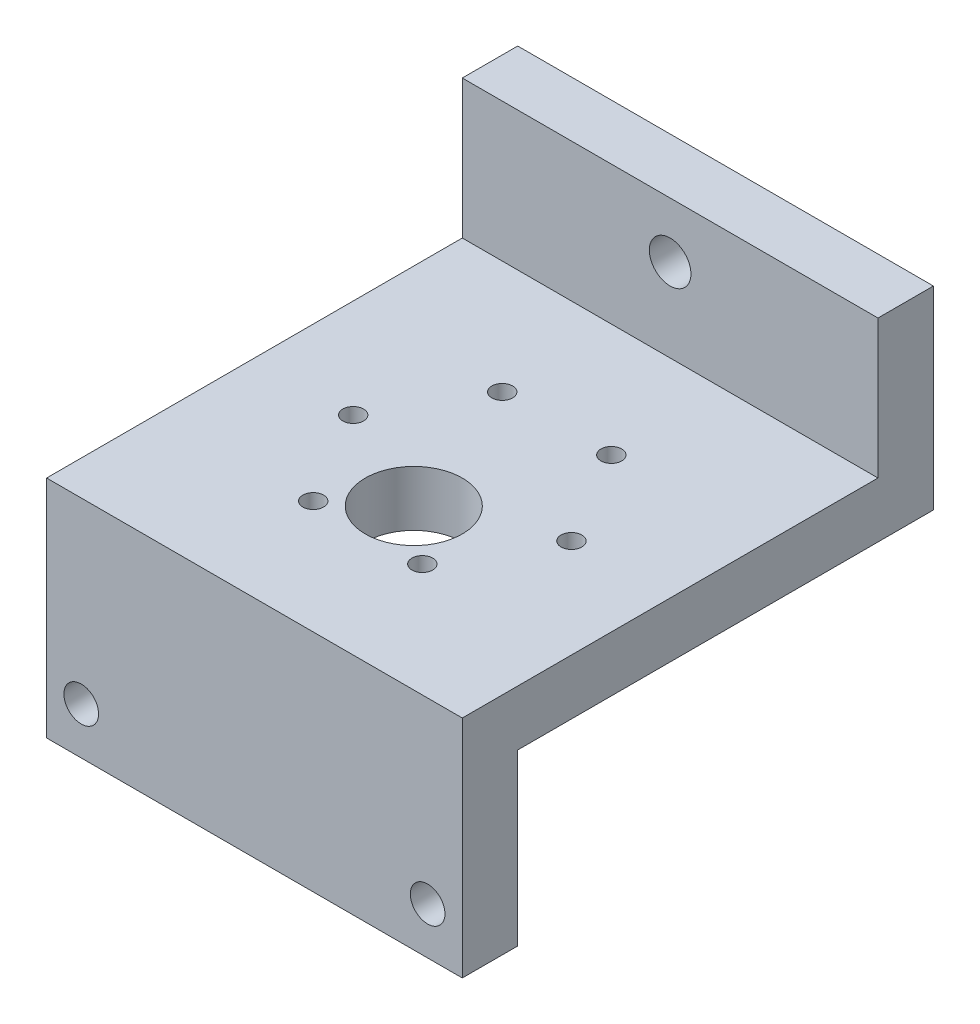
ISO-10303-21;
HEADER;
FILE_DESCRIPTION(('STEP AP214'),'2;1');
FILE_NAME('part.step','',(''),(''),'','','');
FILE_SCHEMA(('AUTOMOTIVE_DESIGN { 1 0 10303 214 1 1 1 1 }'));
ENDSEC;
DATA;
#1=APPLICATION_CONTEXT('core data for automotive mechanical design processes');
#2=APPLICATION_PROTOCOL_DEFINITION('international standard','automotive_design',2000,#1);
#3=PRODUCT_CONTEXT('',#1,'mechanical');
#4=PRODUCT('Part','Part','',(#3));
#5=PRODUCT_RELATED_PRODUCT_CATEGORY('part','',(#4));
#6=PRODUCT_DEFINITION_FORMATION('','',#4);
#7=PRODUCT_DEFINITION_CONTEXT('part definition',#1,'design');
#8=PRODUCT_DEFINITION('design','',#6,#7);
#9=PRODUCT_DEFINITION_SHAPE('','',#8);
#10=(LENGTH_UNIT() NAMED_UNIT(*) SI_UNIT(.MILLI.,.METRE.));
#11=(NAMED_UNIT(*) PLANE_ANGLE_UNIT() SI_UNIT($,.RADIAN.));
#12=(NAMED_UNIT(*) SI_UNIT($,.STERADIAN.) SOLID_ANGLE_UNIT());
#13=UNCERTAINTY_MEASURE_WITH_UNIT(LENGTH_MEASURE(1.E-05),#10,'distance_accuracy_value','');
#14=(GEOMETRIC_REPRESENTATION_CONTEXT(3) GLOBAL_UNCERTAINTY_ASSIGNED_CONTEXT((#13)) GLOBAL_UNIT_ASSIGNED_CONTEXT((#10,
#11,#12)) REPRESENTATION_CONTEXT('',''));
#15=CARTESIAN_POINT('',(0.,0.,0.));
#16=DIRECTION('',(0.,0.,1.));
#17=DIRECTION('',(1.,0.,0.));
#18=AXIS2_PLACEMENT_3D('',#15,#16,#17);
#19=CARTESIAN_POINT('',(30.,20.,-8.));
#20=DIRECTION('',(0.,-1.,0.));
#21=DIRECTION('',(0.,0.,-1.));
#22=AXIS2_PLACEMENT_3D('',#19,#20,#21);
#23=PLANE('',#22);
#24=DIRECTION('',(0.,0.,1.));
#25=VECTOR('',#24,1.);
#26=CARTESIAN_POINT('',(-30.,20.,-8.));
#27=LINE('',#26,#25);
#28=CARTESIAN_POINT('',(-30.,20.,-8.));
#29=VERTEX_POINT('',#28);
#30=CARTESIAN_POINT('',(-30.,20.,0.));
#31=VERTEX_POINT('',#30);
#32=EDGE_CURVE('E170',#29,#31,#27,.T.);
#33=ORIENTED_EDGE('',*,*,#32,.T.);
#34=DIRECTION('',(-1.,0.,0.));
#35=VECTOR('',#34,1.);
#36=CARTESIAN_POINT('',(30.,20.,0.));
#37=LINE('',#36,#35);
#38=CARTESIAN_POINT('',(30.,20.,0.));
#39=VERTEX_POINT('',#38);
#40=EDGE_CURVE('E44',#39,#31,#37,.T.);
#41=ORIENTED_EDGE('',*,*,#40,.F.);
#42=DIRECTION('',(0.,0.,1.));
#43=VECTOR('',#42,1.);
#44=CARTESIAN_POINT('',(30.,20.,-8.));
#45=LINE('',#44,#43);
#46=CARTESIAN_POINT('',(30.,20.,-8.));
#47=VERTEX_POINT('',#46);
#48=EDGE_CURVE('E215',#47,#39,#45,.T.);
#49=ORIENTED_EDGE('',*,*,#48,.F.);
#50=DIRECTION('',(-1.,0.,0.));
#51=VECTOR('',#50,1.);
#52=CARTESIAN_POINT('',(30.,20.,-8.));
#53=LINE('',#52,#51);
#54=EDGE_CURVE('E220',#47,#29,#53,.T.);
#55=ORIENTED_EDGE('',*,*,#54,.T.);
#56=EDGE_LOOP('',(#33,#41,#49,#55));
#57=FACE_BOUND('',#56,.T.);
#58=ADVANCED_FACE('F35',(#57),#23,.F.);
#59=CARTESIAN_POINT('',(30.,20.,0.));
#60=DIRECTION('',(0.,0.,-1.));
#61=DIRECTION('',(0.,1.,0.));
#62=AXIS2_PLACEMENT_3D('',#59,#60,#61);
#63=PLANE('',#62);
#64=CARTESIAN_POINT('',(0.,12.,0.));
#65=DIRECTION('',(0.,0.,1.));
#66=DIRECTION('',(1.,0.,0.));
#67=AXIS2_PLACEMENT_3D('',#64,#65,#66);
#68=CIRCLE('',#67,3.);
#69=CARTESIAN_POINT('',(3.,12.,0.));
#70=VERTEX_POINT('',#69);
#71=EDGE_CURVE('E131',#70,#70,#68,.T.);
#72=ORIENTED_EDGE('',*,*,#71,.F.);
#73=EDGE_LOOP('',(#72));
#74=FACE_BOUND('',#73,.T.);
#75=DIRECTION('',(0.,-1.,0.));
#76=VECTOR('',#75,1.);
#77=CARTESIAN_POINT('',(-30.,20.,0.));
#78=LINE('',#77,#76);
#79=CARTESIAN_POINT('',(-30.,0.,0.));
#80=VERTEX_POINT('',#79);
#81=EDGE_CURVE('E223',#31,#80,#78,.T.);
#82=ORIENTED_EDGE('',*,*,#81,.T.);
#83=DIRECTION('',(-1.,0.,0.));
#84=VECTOR('',#83,1.);
#85=CARTESIAN_POINT('',(30.,0.,0.));
#86=LINE('',#85,#84);
#87=CARTESIAN_POINT('',(30.,0.,0.));
#88=VERTEX_POINT('',#87);
#89=EDGE_CURVE('E156',#88,#80,#86,.T.);
#90=ORIENTED_EDGE('',*,*,#89,.F.);
#91=DIRECTION('',(0.,-1.,0.));
#92=VECTOR('',#91,1.);
#93=CARTESIAN_POINT('',(30.,20.,0.));
#94=LINE('',#93,#92);
#95=EDGE_CURVE('E92',#39,#88,#94,.T.);
#96=ORIENTED_EDGE('',*,*,#95,.F.);
#97=ORIENTED_EDGE('',*,*,#40,.T.);
#98=EDGE_LOOP('',(#82,#90,#96,#97));
#99=FACE_BOUND('',#98,.T.);
#100=ADVANCED_FACE('F234',(#74,#99),#63,.F.);
#101=CARTESIAN_POINT('',(30.,0.,0.));
#102=DIRECTION('',(0.,-1.,0.));
#103=DIRECTION('',(0.,0.,-1.));
#104=AXIS2_PLACEMENT_3D('',#101,#102,#103);
#105=PLANE('',#104);
#106=CARTESIAN_POINT('',(7.87499999999999,0.,16.3600998903951));
#107=DIRECTION('',(0.,1.,0.));
#108=DIRECTION('',(0.,0.,1.));
#109=AXIS2_PLACEMENT_3D('',#106,#107,#108);
#110=CIRCLE('',#109,1.5);
#111=CARTESIAN_POINT('',(7.87499999999999,0.,17.8600998903951));
#112=VERTEX_POINT('',#111);
#113=EDGE_CURVE('E193',#112,#112,#110,.T.);
#114=ORIENTED_EDGE('',*,*,#113,.F.);
#115=EDGE_LOOP('',(#114));
#116=FACE_BOUND('',#115,.T.);
#117=CARTESIAN_POINT('',(-7.87500000000001,0.,16.3600998903951));
#118=DIRECTION('',(0.,1.,0.));
#119=DIRECTION('',(0.,0.,1.));
#120=AXIS2_PLACEMENT_3D('',#117,#118,#119);
#121=CIRCLE('',#120,1.5);
#122=CARTESIAN_POINT('',(-7.87500000000001,0.,17.8600998903951));
#123=VERTEX_POINT('',#122);
#124=EDGE_CURVE('E190',#123,#123,#121,.T.);
#125=ORIENTED_EDGE('',*,*,#124,.F.);
#126=EDGE_LOOP('',(#125));
#127=FACE_BOUND('',#126,.T.);
#128=CARTESIAN_POINT('',(-15.75,0.,30.));
#129=DIRECTION('',(0.,1.,0.));
#130=DIRECTION('',(0.,0.,1.));
#131=AXIS2_PLACEMENT_3D('',#128,#129,#130);
#132=CIRCLE('',#131,1.5);
#133=CARTESIAN_POINT('',(-15.75,0.,31.5));
#134=VERTEX_POINT('',#133);
#135=EDGE_CURVE('E187',#134,#134,#132,.T.);
#136=ORIENTED_EDGE('',*,*,#135,.F.);
#137=EDGE_LOOP('',(#136));
#138=FACE_BOUND('',#137,.T.);
#139=CARTESIAN_POINT('',(-7.875,0.,43.6399001096049));
#140=DIRECTION('',(0.,1.,0.));
#141=DIRECTION('',(0.,0.,1.));
#142=AXIS2_PLACEMENT_3D('',#139,#140,#141);
#143=CIRCLE('',#142,1.5);
#144=CARTESIAN_POINT('',(-7.875,0.,45.1399001096049));
#145=VERTEX_POINT('',#144);
#146=EDGE_CURVE('E183',#145,#145,#143,.T.);
#147=ORIENTED_EDGE('',*,*,#146,.F.);
#148=EDGE_LOOP('',(#147));
#149=FACE_BOUND('',#148,.T.);
#150=CARTESIAN_POINT('',(7.875,0.,43.6399001096049));
#151=DIRECTION('',(0.,1.,0.));
#152=DIRECTION('',(0.,0.,1.));
#153=AXIS2_PLACEMENT_3D('',#150,#151,#152);
#154=CIRCLE('',#153,1.5);
#155=CARTESIAN_POINT('',(7.875,0.,45.1399001096049));
#156=VERTEX_POINT('',#155);
#157=EDGE_CURVE('E179',#156,#156,#154,.T.);
#158=ORIENTED_EDGE('',*,*,#157,.F.);
#159=EDGE_LOOP('',(#158));
#160=FACE_BOUND('',#159,.T.);
#161=CARTESIAN_POINT('',(15.75,0.,30.));
#162=DIRECTION('',(0.,1.,0.));
#163=DIRECTION('',(0.,0.,1.));
#164=AXIS2_PLACEMENT_3D('',#161,#162,#163);
#165=CIRCLE('',#164,1.5);
#166=CARTESIAN_POINT('',(15.75,0.,31.5));
#167=VERTEX_POINT('',#166);
#168=EDGE_CURVE('E175',#167,#167,#165,.T.);
#169=ORIENTED_EDGE('',*,*,#168,.F.);
#170=EDGE_LOOP('',(#169));
#171=FACE_BOUND('',#170,.T.);
#172=CARTESIAN_POINT('',(0.,0.,37.));
#173=DIRECTION('',(0.,1.,0.));
#174=DIRECTION('',(0.,0.,1.));
#175=AXIS2_PLACEMENT_3D('',#172,#173,#174);
#176=CIRCLE('',#175,7.);
#177=CARTESIAN_POINT('',(0.,0.,44.));
#178=VERTEX_POINT('',#177);
#179=EDGE_CURVE('E171',#178,#178,#176,.T.);
#180=ORIENTED_EDGE('',*,*,#179,.F.);
#181=EDGE_LOOP('',(#180));
#182=FACE_BOUND('',#181,.T.);
#183=DIRECTION('',(0.,0.,1.));
#184=VECTOR('',#183,1.);
#185=CARTESIAN_POINT('',(-30.,0.,0.));
#186=LINE('',#185,#184);
#187=CARTESIAN_POINT('',(-30.,0.,60.));
#188=VERTEX_POINT('',#187);
#189=EDGE_CURVE('E151',#80,#188,#186,.T.);
#190=ORIENTED_EDGE('',*,*,#189,.T.);
#191=DIRECTION('',(1.,0.,0.));
#192=VECTOR('',#191,1.);
#193=CARTESIAN_POINT('',(-30.,0.,60.));
#194=LINE('',#193,#192);
#195=CARTESIAN_POINT('',(30.,0.,60.));
#196=VERTEX_POINT('',#195);
#197=EDGE_CURVE('E129',#188,#196,#194,.T.);
#198=ORIENTED_EDGE('',*,*,#197,.T.);
#199=DIRECTION('',(0.,0.,1.));
#200=VECTOR('',#199,1.);
#201=CARTESIAN_POINT('',(30.,0.,0.));
#202=LINE('',#201,#200);
#203=EDGE_CURVE('E146',#88,#196,#202,.T.);
#204=ORIENTED_EDGE('',*,*,#203,.F.);
#205=ORIENTED_EDGE('',*,*,#89,.T.);
#206=EDGE_LOOP('',(#190,#198,#204,#205));
#207=FACE_BOUND('',#206,.T.);
#208=ADVANCED_FACE('F237',(#116,#127,#138,#149,#160,#171,#182,#207),#105,.F.);
#209=CARTESIAN_POINT('',(30.,-8.00000000000001,52.));
#210=DIRECTION('',(0.,1.,0.));
#211=DIRECTION('',(0.,0.,1.));
#212=AXIS2_PLACEMENT_3D('',#209,#210,#211);
#213=PLANE('',#212);
#214=CARTESIAN_POINT('',(7.87499999999999,-8.00000000000001,16.3600998903951));
#215=DIRECTION('',(0.,1.,0.));
#216=DIRECTION('',(0.,0.,1.));
#217=AXIS2_PLACEMENT_3D('',#214,#215,#216);
#218=CIRCLE('',#217,1.5);
#219=CARTESIAN_POINT('',(7.87499999999999,-8.00000000000001,17.8600998903951));
#220=VERTEX_POINT('',#219);
#221=EDGE_CURVE('E191',#220,#220,#218,.T.);
#222=ORIENTED_EDGE('',*,*,#221,.T.);
#223=EDGE_LOOP('',(#222));
#224=FACE_BOUND('',#223,.T.);
#225=CARTESIAN_POINT('',(-7.87500000000001,-8.00000000000001,16.3600998903951));
#226=DIRECTION('',(0.,1.,0.));
#227=DIRECTION('',(0.,0.,1.));
#228=AXIS2_PLACEMENT_3D('',#225,#226,#227);
#229=CIRCLE('',#228,1.5);
#230=CARTESIAN_POINT('',(-7.87500000000001,-8.00000000000001,17.8600998903951));
#231=VERTEX_POINT('',#230);
#232=EDGE_CURVE('E188',#231,#231,#229,.T.);
#233=ORIENTED_EDGE('',*,*,#232,.T.);
#234=EDGE_LOOP('',(#233));
#235=FACE_BOUND('',#234,.T.);
#236=CARTESIAN_POINT('',(-15.75,-8.00000000000001,30.));
#237=DIRECTION('',(0.,1.,0.));
#238=DIRECTION('',(0.,0.,1.));
#239=AXIS2_PLACEMENT_3D('',#236,#237,#238);
#240=CIRCLE('',#239,1.5);
#241=CARTESIAN_POINT('',(-15.75,-8.00000000000001,31.5));
#242=VERTEX_POINT('',#241);
#243=EDGE_CURVE('E184',#242,#242,#240,.T.);
#244=ORIENTED_EDGE('',*,*,#243,.T.);
#245=EDGE_LOOP('',(#244));
#246=FACE_BOUND('',#245,.T.);
#247=CARTESIAN_POINT('',(-7.875,-8.00000000000001,43.6399001096049));
#248=DIRECTION('',(0.,1.,0.));
#249=DIRECTION('',(0.,0.,1.));
#250=AXIS2_PLACEMENT_3D('',#247,#248,#249);
#251=CIRCLE('',#250,1.5);
#252=CARTESIAN_POINT('',(-7.875,-8.00000000000001,45.1399001096049));
#253=VERTEX_POINT('',#252);
#254=EDGE_CURVE('E180',#253,#253,#251,.T.);
#255=ORIENTED_EDGE('',*,*,#254,.T.);
#256=EDGE_LOOP('',(#255));
#257=FACE_BOUND('',#256,.T.);
#258=CARTESIAN_POINT('',(7.875,-8.00000000000001,43.6399001096049));
#259=DIRECTION('',(0.,1.,0.));
#260=DIRECTION('',(0.,0.,1.));
#261=AXIS2_PLACEMENT_3D('',#258,#259,#260);
#262=CIRCLE('',#261,1.5);
#263=CARTESIAN_POINT('',(7.875,-8.00000000000001,45.1399001096049));
#264=VERTEX_POINT('',#263);
#265=EDGE_CURVE('E176',#264,#264,#262,.T.);
#266=ORIENTED_EDGE('',*,*,#265,.T.);
#267=EDGE_LOOP('',(#266));
#268=FACE_BOUND('',#267,.T.);
#269=CARTESIAN_POINT('',(15.75,-8.00000000000001,30.));
#270=DIRECTION('',(0.,1.,0.));
#271=DIRECTION('',(0.,0.,1.));
#272=AXIS2_PLACEMENT_3D('',#269,#270,#271);
#273=CIRCLE('',#272,1.5);
#274=CARTESIAN_POINT('',(15.75,-8.00000000000001,31.5));
#275=VERTEX_POINT('',#274);
#276=EDGE_CURVE('E172',#275,#275,#273,.T.);
#277=ORIENTED_EDGE('',*,*,#276,.T.);
#278=EDGE_LOOP('',(#277));
#279=FACE_BOUND('',#278,.T.);
#280=CARTESIAN_POINT('',(0.,-8.00000000000001,37.));
#281=DIRECTION('',(0.,1.,0.));
#282=DIRECTION('',(0.,0.,1.));
#283=AXIS2_PLACEMENT_3D('',#280,#281,#282);
#284=CIRCLE('',#283,7.);
#285=CARTESIAN_POINT('',(0.,-8.00000000000001,44.));
#286=VERTEX_POINT('',#285);
#287=EDGE_CURVE('E167',#286,#286,#284,.T.);
#288=ORIENTED_EDGE('',*,*,#287,.T.);
#289=EDGE_LOOP('',(#288));
#290=FACE_BOUND('',#289,.T.);
#291=DIRECTION('',(0.,0.,-1.));
#292=VECTOR('',#291,1.);
#293=CARTESIAN_POINT('',(-30.,-8.00000000000001,52.));
#294=LINE('',#293,#292);
#295=CARTESIAN_POINT('',(-30.,-8.00000000000001,52.));
#296=VERTEX_POINT('',#295);
#297=CARTESIAN_POINT('',(-30.,-8.00000000000001,-8.00000000000001));
#298=VERTEX_POINT('',#297);
#299=EDGE_CURVE('E149',#296,#298,#294,.T.);
#300=ORIENTED_EDGE('',*,*,#299,.T.);
#301=DIRECTION('',(-1.,0.,0.));
#302=VECTOR('',#301,1.);
#303=CARTESIAN_POINT('',(30.,-8.00000000000001,-8.00000000000001));
#304=LINE('',#303,#302);
#305=CARTESIAN_POINT('',(30.,-8.00000000000001,-8.00000000000001));
#306=VERTEX_POINT('',#305);
#307=EDGE_CURVE('E157',#306,#298,#304,.T.);
#308=ORIENTED_EDGE('',*,*,#307,.F.);
#309=DIRECTION('',(0.,0.,-1.));
#310=VECTOR('',#309,1.);
#311=CARTESIAN_POINT('',(30.,-8.00000000000001,52.));
#312=LINE('',#311,#310);
#313=CARTESIAN_POINT('',(30.,-8.00000000000001,52.));
#314=VERTEX_POINT('',#313);
#315=EDGE_CURVE('E144',#314,#306,#312,.T.);
#316=ORIENTED_EDGE('',*,*,#315,.F.);
#317=DIRECTION('',(-1.,0.,0.));
#318=VECTOR('',#317,1.);
#319=CARTESIAN_POINT('',(30.,-8.00000000000001,52.));
#320=LINE('',#319,#318);
#321=EDGE_CURVE('E152',#314,#296,#320,.T.);
#322=ORIENTED_EDGE('',*,*,#321,.T.);
#323=EDGE_LOOP('',(#300,#308,#316,#322));
#324=FACE_BOUND('',#323,.T.);
#325=ADVANCED_FACE('F246',(#224,#235,#246,#257,#268,#279,#290,#324),#213,.F.);
#326=CARTESIAN_POINT('',(30.,-8.00000000000001,-8.00000000000001));
#327=DIRECTION('',(0.,0.,1.));
#328=DIRECTION('',(0.,-1.,0.));
#329=AXIS2_PLACEMENT_3D('',#326,#327,#328);
#330=PLANE('',#329);
#331=CARTESIAN_POINT('',(0.,12.,-8.));
#332=DIRECTION('',(0.,0.,1.));
#333=DIRECTION('',(0.,-1.,0.));
#334=AXIS2_PLACEMENT_3D('',#331,#332,#333);
#335=CIRCLE('',#334,3.);
#336=CARTESIAN_POINT('',(0.,9.,-8.));
#337=VERTEX_POINT('',#336);
#338=EDGE_CURVE('E158',#337,#337,#335,.T.);
#339=ORIENTED_EDGE('',*,*,#338,.T.);
#340=EDGE_LOOP('',(#339));
#341=FACE_BOUND('',#340,.T.);
#342=DIRECTION('',(0.,1.,0.));
#343=VECTOR('',#342,1.);
#344=CARTESIAN_POINT('',(-30.,-8.00000000000001,-8.00000000000001));
#345=LINE('',#344,#343);
#346=EDGE_CURVE('E84',#298,#29,#345,.T.);
#347=ORIENTED_EDGE('',*,*,#346,.T.);
#348=ORIENTED_EDGE('',*,*,#54,.F.);
#349=DIRECTION('',(0.,1.,0.));
#350=VECTOR('',#349,1.);
#351=CARTESIAN_POINT('',(30.,-8.00000000000001,-8.00000000000001));
#352=LINE('',#351,#350);
#353=EDGE_CURVE('E60',#306,#47,#352,.T.);
#354=ORIENTED_EDGE('',*,*,#353,.F.);
#355=ORIENTED_EDGE('',*,*,#307,.T.);
#356=EDGE_LOOP('',(#347,#348,#354,#355));
#357=FACE_BOUND('',#356,.T.);
#358=ADVANCED_FACE('F230',(#341,#357),#330,.F.);
#359=CARTESIAN_POINT('',(30.,0.,0.));
#360=DIRECTION('',(1.,0.,0.));
#361=DIRECTION('',(0.,0.,-1.));
#362=AXIS2_PLACEMENT_3D('',#359,#360,#361);
#363=PLANE('',#362);
#364=DIRECTION('',(0.,0.,1.));
#365=VECTOR('',#364,1.);
#366=CARTESIAN_POINT('',(30.,-32.5,0.));
#367=LINE('',#366,#365);
#368=CARTESIAN_POINT('',(30.,-32.5,52.));
#369=VERTEX_POINT('',#368);
#370=CARTESIAN_POINT('',(30.,-32.5,60.));
#371=VERTEX_POINT('',#370);
#372=EDGE_CURVE('E51',#369,#371,#367,.T.);
#373=ORIENTED_EDGE('',*,*,#372,.F.);
#374=DIRECTION('',(0.,1.,0.));
#375=VECTOR('',#374,1.);
#376=CARTESIAN_POINT('',(30.,0.,52.));
#377=LINE('',#376,#375);
#378=EDGE_CURVE('E139',#369,#314,#377,.T.);
#379=ORIENTED_EDGE('',*,*,#378,.T.);
#380=ORIENTED_EDGE('',*,*,#315,.T.);
#381=ORIENTED_EDGE('',*,*,#353,.T.);
#382=ORIENTED_EDGE('',*,*,#48,.T.);
#383=ORIENTED_EDGE('',*,*,#95,.T.);
#384=ORIENTED_EDGE('',*,*,#203,.T.);
#385=DIRECTION('',(0.,-1.,0.));
#386=VECTOR('',#385,1.);
#387=CARTESIAN_POINT('',(30.,0.,60.));
#388=LINE('',#387,#386);
#389=EDGE_CURVE('E133',#196,#371,#388,.T.);
#390=ORIENTED_EDGE('',*,*,#389,.T.);
#391=EDGE_LOOP('',(#373,#379,#380,#381,#382,#383,#384,#390));
#392=FACE_BOUND('',#391,.T.);
#393=ADVANCED_FACE('F238',(#392),#363,.T.);
#394=CARTESIAN_POINT('',(-30.,0.,0.));
#395=DIRECTION('',(1.,0.,0.));
#396=DIRECTION('',(0.,0.,-1.));
#397=AXIS2_PLACEMENT_3D('',#394,#395,#396);
#398=PLANE('',#397);
#399=DIRECTION('',(0.,1.,0.));
#400=VECTOR('',#399,1.);
#401=CARTESIAN_POINT('',(-30.,0.,52.));
#402=LINE('',#401,#400);
#403=CARTESIAN_POINT('',(-30.,-32.5,52.));
#404=VERTEX_POINT('',#403);
#405=EDGE_CURVE('E38',#404,#296,#402,.T.);
#406=ORIENTED_EDGE('',*,*,#405,.F.);
#407=DIRECTION('',(0.,0.,-1.));
#408=VECTOR('',#407,1.);
#409=CARTESIAN_POINT('',(-30.,-32.5,0.));
#410=LINE('',#409,#408);
#411=CARTESIAN_POINT('',(-30.,-32.5,60.));
#412=VERTEX_POINT('',#411);
#413=EDGE_CURVE('E110',#412,#404,#410,.T.);
#414=ORIENTED_EDGE('',*,*,#413,.F.);
#415=DIRECTION('',(0.,-1.,0.));
#416=VECTOR('',#415,1.);
#417=CARTESIAN_POINT('',(-30.,0.,60.));
#418=LINE('',#417,#416);
#419=EDGE_CURVE('E121',#188,#412,#418,.T.);
#420=ORIENTED_EDGE('',*,*,#419,.F.);
#421=ORIENTED_EDGE('',*,*,#189,.F.);
#422=ORIENTED_EDGE('',*,*,#81,.F.);
#423=ORIENTED_EDGE('',*,*,#32,.F.);
#424=ORIENTED_EDGE('',*,*,#346,.F.);
#425=ORIENTED_EDGE('',*,*,#299,.F.);
#426=EDGE_LOOP('',(#406,#414,#420,#421,#422,#423,#424,#425));
#427=FACE_BOUND('',#426,.T.);
#428=ADVANCED_FACE('F119',(#427),#398,.F.);
#429=CARTESIAN_POINT('',(0.,-55.,37.));
#430=DIRECTION('',(0.,1.,0.));
#431=DIRECTION('',(0.,0.,1.));
#432=AXIS2_PLACEMENT_3D('',#429,#430,#431);
#433=CYLINDRICAL_SURFACE('',#432,7.);
#434=ORIENTED_EDGE('',*,*,#179,.T.);
#435=EDGE_LOOP('',(#434));
#436=FACE_BOUND('',#435,.T.);
#437=ORIENTED_EDGE('',*,*,#287,.F.);
#438=EDGE_LOOP('',(#437));
#439=FACE_BOUND('',#438,.T.);
#440=ADVANCED_FACE('F301',(#436,#439),#433,.F.);
#441=CARTESIAN_POINT('',(15.75,-55.,30.));
#442=DIRECTION('',(0.,1.,0.));
#443=DIRECTION('',(0.,0.,1.));
#444=AXIS2_PLACEMENT_3D('',#441,#442,#443);
#445=CYLINDRICAL_SURFACE('',#444,1.5);
#446=ORIENTED_EDGE('',*,*,#168,.T.);
#447=EDGE_LOOP('',(#446));
#448=FACE_BOUND('',#447,.T.);
#449=ORIENTED_EDGE('',*,*,#276,.F.);
#450=EDGE_LOOP('',(#449));
#451=FACE_BOUND('',#450,.T.);
#452=ADVANCED_FACE('F297',(#448,#451),#445,.F.);
#453=CARTESIAN_POINT('',(7.875,-55.,43.6399001096049));
#454=DIRECTION('',(0.,1.,0.));
#455=DIRECTION('',(0.,0.,1.));
#456=AXIS2_PLACEMENT_3D('',#453,#454,#455);
#457=CYLINDRICAL_SURFACE('',#456,1.5);
#458=ORIENTED_EDGE('',*,*,#157,.T.);
#459=EDGE_LOOP('',(#458));
#460=FACE_BOUND('',#459,.T.);
#461=ORIENTED_EDGE('',*,*,#265,.F.);
#462=EDGE_LOOP('',(#461));
#463=FACE_BOUND('',#462,.T.);
#464=ADVANCED_FACE('F293',(#460,#463),#457,.F.);
#465=CARTESIAN_POINT('',(-7.875,-55.,43.6399001096049));
#466=DIRECTION('',(0.,1.,0.));
#467=DIRECTION('',(0.,0.,1.));
#468=AXIS2_PLACEMENT_3D('',#465,#466,#467);
#469=CYLINDRICAL_SURFACE('',#468,1.5);
#470=ORIENTED_EDGE('',*,*,#146,.T.);
#471=EDGE_LOOP('',(#470));
#472=FACE_BOUND('',#471,.T.);
#473=ORIENTED_EDGE('',*,*,#254,.F.);
#474=EDGE_LOOP('',(#473));
#475=FACE_BOUND('',#474,.T.);
#476=ADVANCED_FACE('F289',(#472,#475),#469,.F.);
#477=CARTESIAN_POINT('',(-15.75,-55.,30.));
#478=DIRECTION('',(0.,1.,0.));
#479=DIRECTION('',(0.,0.,1.));
#480=AXIS2_PLACEMENT_3D('',#477,#478,#479);
#481=CYLINDRICAL_SURFACE('',#480,1.5);
#482=ORIENTED_EDGE('',*,*,#135,.T.);
#483=EDGE_LOOP('',(#482));
#484=FACE_BOUND('',#483,.T.);
#485=ORIENTED_EDGE('',*,*,#243,.F.);
#486=EDGE_LOOP('',(#485));
#487=FACE_BOUND('',#486,.T.);
#488=ADVANCED_FACE('F285',(#484,#487),#481,.F.);
#489=CARTESIAN_POINT('',(-7.87500000000001,-55.,16.3600998903951));
#490=DIRECTION('',(0.,1.,0.));
#491=DIRECTION('',(0.,0.,1.));
#492=AXIS2_PLACEMENT_3D('',#489,#490,#491);
#493=CYLINDRICAL_SURFACE('',#492,1.5);
#494=ORIENTED_EDGE('',*,*,#124,.T.);
#495=EDGE_LOOP('',(#494));
#496=FACE_BOUND('',#495,.T.);
#497=ORIENTED_EDGE('',*,*,#232,.F.);
#498=EDGE_LOOP('',(#497));
#499=FACE_BOUND('',#498,.T.);
#500=ADVANCED_FACE('F279',(#496,#499),#493,.F.);
#501=CARTESIAN_POINT('',(7.87499999999999,-55.,16.3600998903951));
#502=DIRECTION('',(0.,1.,0.));
#503=DIRECTION('',(0.,0.,1.));
#504=AXIS2_PLACEMENT_3D('',#501,#502,#503);
#505=CYLINDRICAL_SURFACE('',#504,1.5);
#506=ORIENTED_EDGE('',*,*,#113,.T.);
#507=EDGE_LOOP('',(#506));
#508=FACE_BOUND('',#507,.T.);
#509=ORIENTED_EDGE('',*,*,#221,.F.);
#510=EDGE_LOOP('',(#509));
#511=FACE_BOUND('',#510,.T.);
#512=ADVANCED_FACE('F271',(#508,#511),#505,.F.);
#513=CARTESIAN_POINT('',(0.,12.,-55.));
#514=DIRECTION('',(0.,0.,1.));
#515=DIRECTION('',(1.,0.,0.));
#516=AXIS2_PLACEMENT_3D('',#513,#514,#515);
#517=CYLINDRICAL_SURFACE('',#516,3.);
#518=ORIENTED_EDGE('',*,*,#71,.T.);
#519=EDGE_LOOP('',(#518));
#520=FACE_BOUND('',#519,.T.);
#521=ORIENTED_EDGE('',*,*,#338,.F.);
#522=EDGE_LOOP('',(#521));
#523=FACE_BOUND('',#522,.T.);
#524=ADVANCED_FACE('F268',(#520,#523),#517,.F.);
#525=CARTESIAN_POINT('',(-30.,0.,52.));
#526=DIRECTION('',(0.,0.,-1.));
#527=DIRECTION('',(0.,1.,0.));
#528=AXIS2_PLACEMENT_3D('',#525,#526,#527);
#529=PLANE('',#528);
#530=DIRECTION('',(-1.,0.,0.));
#531=VECTOR('',#530,1.);
#532=CARTESIAN_POINT('',(30.00005,-32.5,52.));
#533=LINE('',#532,#531);
#534=EDGE_CURVE('E123',#369,#404,#533,.T.);
#535=ORIENTED_EDGE('',*,*,#534,.T.);
#536=ORIENTED_EDGE('',*,*,#405,.T.);
#537=ORIENTED_EDGE('',*,*,#321,.F.);
#538=ORIENTED_EDGE('',*,*,#378,.F.);
#539=EDGE_LOOP('',(#535,#536,#537,#538));
#540=FACE_BOUND('',#539,.T.);
#541=CARTESIAN_POINT('',(-24.9999999999998,-25.75,52.));
#542=DIRECTION('',(0.,0.,-1.));
#543=DIRECTION('',(0.,1.,0.));
#544=AXIS2_PLACEMENT_3D('',#541,#542,#543);
#545=CIRCLE('',#544,2.49999999999999);
#546=CARTESIAN_POINT('',(-24.9999999999998,-23.25,52.));
#547=VERTEX_POINT('',#546);
#548=EDGE_CURVE('E439',#547,#547,#545,.T.);
#549=ORIENTED_EDGE('',*,*,#548,.F.);
#550=EDGE_LOOP('',(#549));
#551=FACE_BOUND('',#550,.T.);
#552=CARTESIAN_POINT('',(25.0000000000002,-25.75,52.));
#553=DIRECTION('',(0.,0.,-1.));
#554=DIRECTION('',(0.,1.,0.));
#555=AXIS2_PLACEMENT_3D('',#552,#553,#554);
#556=CIRCLE('',#555,2.5);
#557=CARTESIAN_POINT('',(25.0000000000002,-23.25,52.));
#558=VERTEX_POINT('',#557);
#559=EDGE_CURVE('E140',#558,#558,#556,.T.);
#560=ORIENTED_EDGE('',*,*,#559,.F.);
#561=EDGE_LOOP('',(#560));
#562=FACE_BOUND('',#561,.T.);
#563=ADVANCED_FACE('F244',(#540,#551,#562),#529,.T.);
#564=CARTESIAN_POINT('',(-30.,0.,60.));
#565=DIRECTION('',(0.,0.,1.));
#566=DIRECTION('',(0.,-1.,0.));
#567=AXIS2_PLACEMENT_3D('',#564,#565,#566);
#568=PLANE('',#567);
#569=DIRECTION('',(-1.,0.,0.));
#570=VECTOR('',#569,1.);
#571=CARTESIAN_POINT('',(-30.,-32.5,60.));
#572=LINE('',#571,#570);
#573=EDGE_CURVE('E11',#371,#412,#572,.T.);
#574=ORIENTED_EDGE('',*,*,#573,.F.);
#575=ORIENTED_EDGE('',*,*,#389,.F.);
#576=ORIENTED_EDGE('',*,*,#197,.F.);
#577=ORIENTED_EDGE('',*,*,#419,.T.);
#578=EDGE_LOOP('',(#574,#575,#576,#577));
#579=FACE_BOUND('',#578,.T.);
#580=CARTESIAN_POINT('',(-24.9999999999998,-25.75,60.));
#581=DIRECTION('',(0.,0.,1.));
#582=DIRECTION('',(1.,0.,0.));
#583=AXIS2_PLACEMENT_3D('',#580,#581,#582);
#584=CIRCLE('',#583,2.49999999999999);
#585=CARTESIAN_POINT('',(-22.4999999999999,-25.75,60.));
#586=VERTEX_POINT('',#585);
#587=EDGE_CURVE('E241',#586,#586,#584,.T.);
#588=ORIENTED_EDGE('',*,*,#587,.F.);
#589=EDGE_LOOP('',(#588));
#590=FACE_BOUND('',#589,.T.);
#591=CARTESIAN_POINT('',(25.0000000000002,-25.75,60.));
#592=DIRECTION('',(0.,0.,1.));
#593=DIRECTION('',(1.,0.,0.));
#594=AXIS2_PLACEMENT_3D('',#591,#592,#593);
#595=CIRCLE('',#594,2.5);
#596=CARTESIAN_POINT('',(27.5000000000002,-25.75,60.));
#597=VERTEX_POINT('',#596);
#598=EDGE_CURVE('E443',#597,#597,#595,.T.);
#599=ORIENTED_EDGE('',*,*,#598,.F.);
#600=EDGE_LOOP('',(#599));
#601=FACE_BOUND('',#600,.T.);
#602=ADVANCED_FACE('F126',(#579,#590,#601),#568,.T.);
#603=CARTESIAN_POINT('',(25.0000000000002,-25.75,50.));
#604=DIRECTION('',(0.,0.,1.));
#605=DIRECTION('',(1.,0.,0.));
#606=AXIS2_PLACEMENT_3D('',#603,#604,#605);
#607=CYLINDRICAL_SURFACE('',#606,2.5);
#608=ORIENTED_EDGE('',*,*,#559,.T.);
#609=EDGE_LOOP('',(#608));
#610=FACE_BOUND('',#609,.T.);
#611=ORIENTED_EDGE('',*,*,#598,.T.);
#612=EDGE_LOOP('',(#611));
#613=FACE_BOUND('',#612,.T.);
#614=ADVANCED_FACE('F375',(#610,#613),#607,.F.);
#615=CARTESIAN_POINT('',(-24.9999999999998,-25.75,50.));
#616=DIRECTION('',(0.,0.,1.));
#617=DIRECTION('',(1.,0.,0.));
#618=AXIS2_PLACEMENT_3D('',#615,#616,#617);
#619=CYLINDRICAL_SURFACE('',#618,2.49999999999999);
#620=ORIENTED_EDGE('',*,*,#548,.T.);
#621=EDGE_LOOP('',(#620));
#622=FACE_BOUND('',#621,.T.);
#623=ORIENTED_EDGE('',*,*,#587,.T.);
#624=EDGE_LOOP('',(#623));
#625=FACE_BOUND('',#624,.T.);
#626=ADVANCED_FACE('F380',(#622,#625),#619,.F.);
#627=CARTESIAN_POINT('',(30.00005,-32.5,0.));
#628=DIRECTION('',(0.,1.,0.));
#629=DIRECTION('',(0.,0.,1.));
#630=AXIS2_PLACEMENT_3D('',#627,#628,#629);
#631=PLANE('',#630);
#632=ORIENTED_EDGE('',*,*,#372,.T.);
#633=ORIENTED_EDGE('',*,*,#573,.T.);
#634=ORIENTED_EDGE('',*,*,#413,.T.);
#635=ORIENTED_EDGE('',*,*,#534,.F.);
#636=EDGE_LOOP('',(#632,#633,#634,#635));
#637=FACE_BOUND('',#636,.T.);
#638=ADVANCED_FACE('F109',(#637),#631,.F.);
#639=CLOSED_SHELL('',(#58,#100,#208,#325,#358,#393,#428,#440,#452,#464,#476,#488,#500,#512,#524,
#563,#602,#614,#626,#638));
#640=MANIFOLD_SOLID_BREP('B2',#639);
#641=ADVANCED_BREP_SHAPE_REPRESENTATION('',(#18,#640),#14);
#642=SHAPE_DEFINITION_REPRESENTATION(#9,#641);
ENDSEC;
END-ISO-10303-21;
